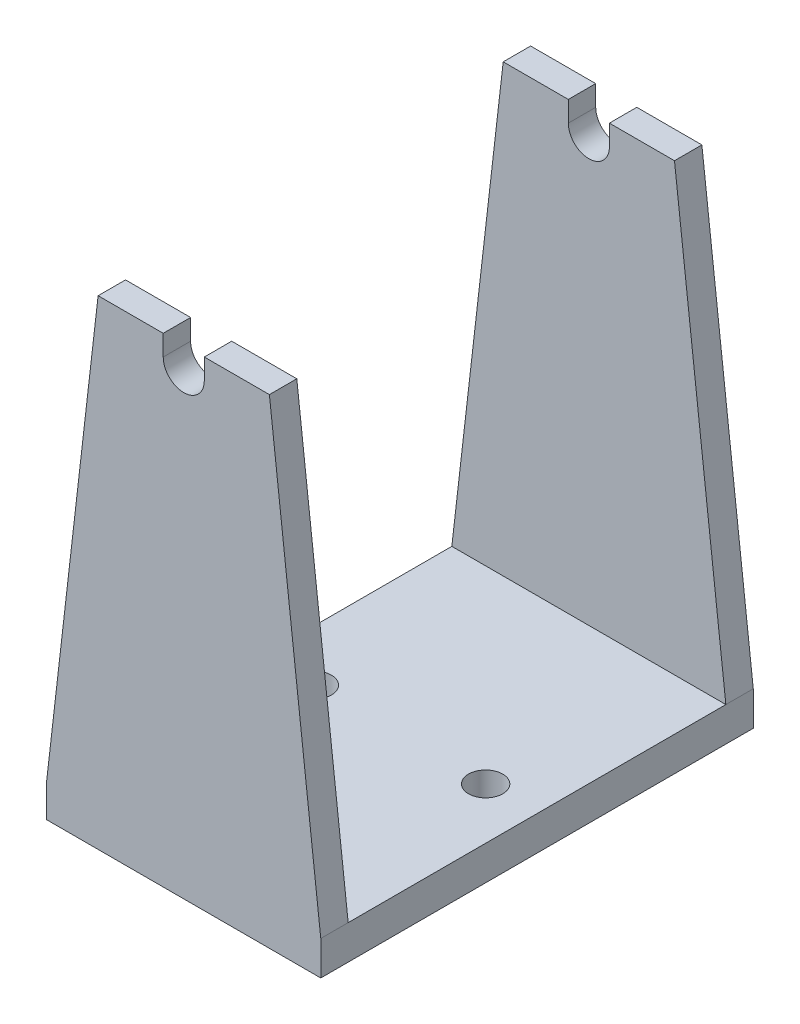
ISO-10303-21;
HEADER;
FILE_DESCRIPTION(('STEP AP214'),'2;1');
FILE_NAME('part.step','',(''),(''),'','','');
FILE_SCHEMA(('AUTOMOTIVE_DESIGN { 1 0 10303 214 1 1 1 1 }'));
ENDSEC;
DATA;
#1=APPLICATION_CONTEXT('core data for automotive mechanical design processes');
#2=APPLICATION_PROTOCOL_DEFINITION('international standard','automotive_design',2000,#1);
#3=PRODUCT_CONTEXT('',#1,'mechanical');
#4=PRODUCT('Part','Part','',(#3));
#5=PRODUCT_RELATED_PRODUCT_CATEGORY('part','',(#4));
#6=PRODUCT_DEFINITION_FORMATION('','',#4);
#7=PRODUCT_DEFINITION_CONTEXT('part definition',#1,'design');
#8=PRODUCT_DEFINITION('design','',#6,#7);
#9=PRODUCT_DEFINITION_SHAPE('','',#8);
#10=(LENGTH_UNIT() NAMED_UNIT(*) SI_UNIT(.MILLI.,.METRE.));
#11=(NAMED_UNIT(*) PLANE_ANGLE_UNIT() SI_UNIT($,.RADIAN.));
#12=(NAMED_UNIT(*) SI_UNIT($,.STERADIAN.) SOLID_ANGLE_UNIT());
#13=UNCERTAINTY_MEASURE_WITH_UNIT(LENGTH_MEASURE(1.E-05),#10,'distance_accuracy_value','');
#14=(GEOMETRIC_REPRESENTATION_CONTEXT(3) GLOBAL_UNCERTAINTY_ASSIGNED_CONTEXT((#13)) GLOBAL_UNIT_ASSIGNED_CONTEXT((#10,
#11,#12)) REPRESENTATION_CONTEXT('',''));
#15=CARTESIAN_POINT('',(0.,0.,0.));
#16=DIRECTION('',(0.,0.,1.));
#17=DIRECTION('',(1.,0.,0.));
#18=AXIS2_PLACEMENT_3D('',#15,#16,#17);
#19=CARTESIAN_POINT('',(20.,5.,4.));
#20=DIRECTION('',(-0.993408935871131,-0.114624107985131,0.));
#21=DIRECTION('',(0.114624107985131,-0.993408935871131,0.));
#22=AXIS2_PLACEMENT_3D('',#19,#20,#21);
#23=PLANE('',#22);
#24=DIRECTION('',(-0.114624107985131,0.993408935871131,0.));
#25=VECTOR('',#24,1.);
#26=CARTESIAN_POINT('',(20.,5.,0.));
#27=LINE('',#26,#25);
#28=CARTESIAN_POINT('',(20.,5.,0.));
#29=VERTEX_POINT('',#28);
#30=CARTESIAN_POINT('',(12.5,70.,0.));
#31=VERTEX_POINT('',#30);
#32=EDGE_CURVE('E144',#29,#31,#27,.T.);
#33=ORIENTED_EDGE('',*,*,#32,.T.);
#34=DIRECTION('',(0.,0.,-1.));
#35=VECTOR('',#34,1.);
#36=CARTESIAN_POINT('',(12.5,70.,4.));
#37=LINE('',#36,#35);
#38=CARTESIAN_POINT('',(12.5,70.,4.));
#39=VERTEX_POINT('',#38);
#40=EDGE_CURVE('E11',#39,#31,#37,.T.);
#41=ORIENTED_EDGE('',*,*,#40,.F.);
#42=DIRECTION('',(-0.114624107985131,0.993408935871131,0.));
#43=VECTOR('',#42,1.);
#44=CARTESIAN_POINT('',(20.,5.,4.));
#45=LINE('',#44,#43);
#46=CARTESIAN_POINT('',(20.,5.,4.));
#47=VERTEX_POINT('',#46);
#48=EDGE_CURVE('E163',#47,#39,#45,.T.);
#49=ORIENTED_EDGE('',*,*,#48,.F.);
#50=DIRECTION('',(0.,0.,-1.));
#51=VECTOR('',#50,1.);
#52=CARTESIAN_POINT('',(20.,5.,4.));
#53=LINE('',#52,#51);
#54=EDGE_CURVE('E140',#47,#29,#53,.T.);
#55=ORIENTED_EDGE('',*,*,#54,.T.);
#56=EDGE_LOOP('',(#33,#41,#49,#55));
#57=FACE_BOUND('',#56,.T.);
#58=ADVANCED_FACE('F33',(#57),#23,.F.);
#59=CARTESIAN_POINT('',(12.5,70.,4.));
#60=DIRECTION('',(0.,-1.,0.));
#61=DIRECTION('',(0.,0.,-1.));
#62=AXIS2_PLACEMENT_3D('',#59,#60,#61);
#63=PLANE('',#62);
#64=DIRECTION('',(-1.,0.,0.));
#65=VECTOR('',#64,1.);
#66=CARTESIAN_POINT('',(12.5,70.,0.));
#67=LINE('',#66,#65);
#68=CARTESIAN_POINT('',(2.99778569235798,70.,0.));
#69=VERTEX_POINT('',#68);
#70=EDGE_CURVE('E147',#31,#69,#67,.T.);
#71=ORIENTED_EDGE('',*,*,#70,.T.);
#72=DIRECTION('',(0.,0.,-1.));
#73=VECTOR('',#72,1.);
#74=CARTESIAN_POINT('',(2.99778569235798,70.,4.));
#75=LINE('',#74,#73);
#76=CARTESIAN_POINT('',(2.99778569235798,70.,4.));
#77=VERTEX_POINT('',#76);
#78=EDGE_CURVE('E41',#77,#69,#75,.T.);
#79=ORIENTED_EDGE('',*,*,#78,.F.);
#80=DIRECTION('',(-1.,0.,0.));
#81=VECTOR('',#80,1.);
#82=CARTESIAN_POINT('',(12.5,70.,4.));
#83=LINE('',#82,#81);
#84=EDGE_CURVE('E100',#39,#77,#83,.T.);
#85=ORIENTED_EDGE('',*,*,#84,.F.);
#86=ORIENTED_EDGE('',*,*,#40,.T.);
#87=EDGE_LOOP('',(#71,#79,#85,#86));
#88=FACE_BOUND('',#87,.T.);
#89=ADVANCED_FACE('F401',(#88),#63,.F.);
#90=CARTESIAN_POINT('',(2.99778569235798,70.,4.));
#91=DIRECTION('',(1.,0.,0.));
#92=DIRECTION('',(0.,1.,0.));
#93=AXIS2_PLACEMENT_3D('',#90,#91,#92);
#94=PLANE('',#93);
#95=DIRECTION('',(0.,-1.,0.));
#96=VECTOR('',#95,1.);
#97=CARTESIAN_POINT('',(2.99778569235798,70.,0.));
#98=LINE('',#97,#96);
#99=CARTESIAN_POINT('',(2.99778569235798,67.,0.));
#100=VERTEX_POINT('',#99);
#101=EDGE_CURVE('E150',#69,#100,#98,.T.);
#102=ORIENTED_EDGE('',*,*,#101,.T.);
#103=DIRECTION('',(0.,0.,-1.));
#104=VECTOR('',#103,1.);
#105=CARTESIAN_POINT('',(2.99778569235798,67.,4.));
#106=LINE('',#105,#104);
#107=CARTESIAN_POINT('',(2.99778569235798,67.,4.));
#108=VERTEX_POINT('',#107);
#109=EDGE_CURVE('E174',#108,#100,#106,.T.);
#110=ORIENTED_EDGE('',*,*,#109,.F.);
#111=DIRECTION('',(0.,-1.,0.));
#112=VECTOR('',#111,1.);
#113=CARTESIAN_POINT('',(2.99778569235798,70.,4.));
#114=LINE('',#113,#112);
#115=EDGE_CURVE('E182',#77,#108,#114,.T.);
#116=ORIENTED_EDGE('',*,*,#115,.F.);
#117=ORIENTED_EDGE('',*,*,#78,.T.);
#118=EDGE_LOOP('',(#102,#110,#116,#117));
#119=FACE_BOUND('',#118,.T.);
#120=ADVANCED_FACE('F180',(#119),#94,.F.);
#121=CARTESIAN_POINT('',(0.,67.,4.));
#122=DIRECTION('',(0.,0.,-1.));
#123=DIRECTION('',(-1.,0.,0.));
#124=AXIS2_PLACEMENT_3D('',#121,#122,#123);
#125=CYLINDRICAL_SURFACE('',#124,2.99778569235798);
#126=CARTESIAN_POINT('',(0.,67.,0.));
#127=DIRECTION('',(0.,0.,-1.));
#128=DIRECTION('',(1.,0.,0.));
#129=AXIS2_PLACEMENT_3D('',#126,#127,#128);
#130=CIRCLE('',#129,2.99778569235798);
#131=CARTESIAN_POINT('',(-2.99778569235798,67.,0.));
#132=VERTEX_POINT('',#131);
#133=EDGE_CURVE('E152',#100,#132,#130,.T.);
#134=ORIENTED_EDGE('',*,*,#133,.T.);
#135=DIRECTION('',(0.,0.,-1.));
#136=VECTOR('',#135,1.);
#137=CARTESIAN_POINT('',(-2.99778569235798,67.,4.));
#138=LINE('',#137,#136);
#139=CARTESIAN_POINT('',(-2.99778569235798,67.,4.));
#140=VERTEX_POINT('',#139);
#141=EDGE_CURVE('E132',#140,#132,#138,.T.);
#142=ORIENTED_EDGE('',*,*,#141,.F.);
#143=CARTESIAN_POINT('',(0.,67.,4.));
#144=DIRECTION('',(0.,0.,-1.));
#145=DIRECTION('',(1.,0.,0.));
#146=AXIS2_PLACEMENT_3D('',#143,#144,#145);
#147=CIRCLE('',#146,2.99778569235798);
#148=EDGE_CURVE('E120',#108,#140,#147,.T.);
#149=ORIENTED_EDGE('',*,*,#148,.F.);
#150=ORIENTED_EDGE('',*,*,#109,.T.);
#151=EDGE_LOOP('',(#134,#142,#149,#150));
#152=FACE_BOUND('',#151,.T.);
#153=ADVANCED_FACE('F188',(#152),#125,.F.);
#154=CARTESIAN_POINT('',(-2.99778569235798,70.,4.));
#155=DIRECTION('',(-1.,0.,0.));
#156=DIRECTION('',(0.,-1.,0.));
#157=AXIS2_PLACEMENT_3D('',#154,#155,#156);
#158=PLANE('',#157);
#159=DIRECTION('',(0.,1.,0.));
#160=VECTOR('',#159,1.);
#161=CARTESIAN_POINT('',(-2.99778569235798,70.,0.));
#162=LINE('',#161,#160);
#163=CARTESIAN_POINT('',(-2.99778569235798,70.,0.));
#164=VERTEX_POINT('',#163);
#165=EDGE_CURVE('E129',#132,#164,#162,.T.);
#166=ORIENTED_EDGE('',*,*,#165,.T.);
#167=DIRECTION('',(0.,0.,-1.));
#168=VECTOR('',#167,1.);
#169=CARTESIAN_POINT('',(-2.99778569235798,70.,4.));
#170=LINE('',#169,#168);
#171=CARTESIAN_POINT('',(-2.99778569235798,70.,4.));
#172=VERTEX_POINT('',#171);
#173=EDGE_CURVE('E126',#172,#164,#170,.T.);
#174=ORIENTED_EDGE('',*,*,#173,.F.);
#175=DIRECTION('',(0.,1.,0.));
#176=VECTOR('',#175,1.);
#177=CARTESIAN_POINT('',(-2.99778569235798,70.,4.));
#178=LINE('',#177,#176);
#179=EDGE_CURVE('E113',#140,#172,#178,.T.);
#180=ORIENTED_EDGE('',*,*,#179,.F.);
#181=ORIENTED_EDGE('',*,*,#141,.T.);
#182=EDGE_LOOP('',(#166,#174,#180,#181));
#183=FACE_BOUND('',#182,.T.);
#184=ADVANCED_FACE('F127',(#183),#158,.F.);
#185=CARTESIAN_POINT('',(-12.5,70.,4.));
#186=DIRECTION('',(0.,-1.,0.));
#187=DIRECTION('',(0.,0.,-1.));
#188=AXIS2_PLACEMENT_3D('',#185,#186,#187);
#189=PLANE('',#188);
#190=DIRECTION('',(-1.,0.,0.));
#191=VECTOR('',#190,1.);
#192=CARTESIAN_POINT('',(-12.5,70.,0.));
#193=LINE('',#192,#191);
#194=CARTESIAN_POINT('',(-12.5,70.,0.));
#195=VERTEX_POINT('',#194);
#196=EDGE_CURVE('E155',#164,#195,#193,.T.);
#197=ORIENTED_EDGE('',*,*,#196,.T.);
#198=DIRECTION('',(0.,0.,-1.));
#199=VECTOR('',#198,1.);
#200=CARTESIAN_POINT('',(-12.5,70.,4.));
#201=LINE('',#200,#199);
#202=CARTESIAN_POINT('',(-12.5,70.,4.));
#203=VERTEX_POINT('',#202);
#204=EDGE_CURVE('E133',#203,#195,#201,.T.);
#205=ORIENTED_EDGE('',*,*,#204,.F.);
#206=DIRECTION('',(-1.,0.,0.));
#207=VECTOR('',#206,1.);
#208=CARTESIAN_POINT('',(-12.5,70.,4.));
#209=LINE('',#208,#207);
#210=EDGE_CURVE('E117',#172,#203,#209,.T.);
#211=ORIENTED_EDGE('',*,*,#210,.F.);
#212=ORIENTED_EDGE('',*,*,#173,.T.);
#213=EDGE_LOOP('',(#197,#205,#211,#212));
#214=FACE_BOUND('',#213,.T.);
#215=ADVANCED_FACE('F135',(#214),#189,.F.);
#216=CARTESIAN_POINT('',(-20.,5.,4.));
#217=DIRECTION('',(0.993408935871131,-0.114624107985131,0.));
#218=DIRECTION('',(0.114624107985131,0.993408935871131,0.));
#219=AXIS2_PLACEMENT_3D('',#216,#217,#218);
#220=PLANE('',#219);
#221=DIRECTION('',(-0.114624107985131,-0.993408935871131,0.));
#222=VECTOR('',#221,1.);
#223=CARTESIAN_POINT('',(-20.,5.,0.));
#224=LINE('',#223,#222);
#225=CARTESIAN_POINT('',(-20.,5.,0.));
#226=VERTEX_POINT('',#225);
#227=EDGE_CURVE('E157',#195,#226,#224,.T.);
#228=ORIENTED_EDGE('',*,*,#227,.T.);
#229=DIRECTION('',(0.,0.,-1.));
#230=VECTOR('',#229,1.);
#231=CARTESIAN_POINT('',(-20.,5.,4.));
#232=LINE('',#231,#230);
#233=CARTESIAN_POINT('',(-20.,5.,4.));
#234=VERTEX_POINT('',#233);
#235=EDGE_CURVE('E169',#234,#226,#232,.T.);
#236=ORIENTED_EDGE('',*,*,#235,.F.);
#237=DIRECTION('',(-0.114624107985131,-0.993408935871131,0.));
#238=VECTOR('',#237,1.);
#239=CARTESIAN_POINT('',(-20.,5.,4.));
#240=LINE('',#239,#238);
#241=EDGE_CURVE('E138',#203,#234,#240,.T.);
#242=ORIENTED_EDGE('',*,*,#241,.F.);
#243=ORIENTED_EDGE('',*,*,#204,.T.);
#244=EDGE_LOOP('',(#228,#236,#242,#243));
#245=FACE_BOUND('',#244,.T.);
#246=ADVANCED_FACE('F417',(#245),#220,.F.);
#247=CARTESIAN_POINT('',(-20.,0.,4.));
#248=DIRECTION('',(1.,0.,0.));
#249=DIRECTION('',(0.,0.,-1.));
#250=AXIS2_PLACEMENT_3D('',#247,#248,#249);
#251=PLANE('',#250);
#252=DIRECTION('',(0.,-1.,0.));
#253=VECTOR('',#252,1.);
#254=CARTESIAN_POINT('',(-20.,0.,0.));
#255=LINE('',#254,#253);
#256=CARTESIAN_POINT('',(-20.,0.,0.));
#257=VERTEX_POINT('',#256);
#258=EDGE_CURVE('E159',#226,#257,#255,.T.);
#259=ORIENTED_EDGE('',*,*,#258,.T.);
#260=DIRECTION('',(0.,0.,-1.));
#261=VECTOR('',#260,1.);
#262=CARTESIAN_POINT('',(-20.,0.,4.));
#263=LINE('',#262,#261);
#264=CARTESIAN_POINT('',(-20.,0.,63.13));
#265=VERTEX_POINT('',#264);
#266=EDGE_CURVE('E167',#265,#257,#263,.T.);
#267=ORIENTED_EDGE('',*,*,#266,.F.);
#268=DIRECTION('',(0.,-1.,0.));
#269=VECTOR('',#268,1.);
#270=CARTESIAN_POINT('',(-20.,5.,63.13));
#271=LINE('',#270,#269);
#272=CARTESIAN_POINT('',(-20.,5.,63.13));
#273=VERTEX_POINT('',#272);
#274=EDGE_CURVE('E258',#273,#265,#271,.T.);
#275=ORIENTED_EDGE('',*,*,#274,.F.);
#276=DIRECTION('',(0.,0.,-1.));
#277=VECTOR('',#276,1.);
#278=CARTESIAN_POINT('',(-20.,5.,63.13));
#279=LINE('',#278,#277);
#280=CARTESIAN_POINT('',(-20.,5.,59.13));
#281=VERTEX_POINT('',#280);
#282=EDGE_CURVE('E217',#273,#281,#279,.T.);
#283=ORIENTED_EDGE('',*,*,#282,.T.);
#284=DIRECTION('',(0.,0.,-1.));
#285=VECTOR('',#284,1.);
#286=CARTESIAN_POINT('',(-20.,5.,59.13));
#287=LINE('',#286,#285);
#288=EDGE_CURVE('E195',#281,#234,#287,.T.);
#289=ORIENTED_EDGE('',*,*,#288,.T.);
#290=ORIENTED_EDGE('',*,*,#235,.T.);
#291=EDGE_LOOP('',(#259,#267,#275,#283,#289,#290));
#292=FACE_BOUND('',#291,.T.);
#293=ADVANCED_FACE('F314',(#292),#251,.F.);
#294=CARTESIAN_POINT('',(-20.,0.,4.));
#295=DIRECTION('',(0.,1.,0.));
#296=DIRECTION('',(0.,0.,1.));
#297=AXIS2_PLACEMENT_3D('',#294,#295,#296);
#298=PLANE('',#297);
#299=CARTESIAN_POINT('',(-12.5,0.,31.565));
#300=DIRECTION('',(0.,1.,0.));
#301=DIRECTION('',(0.,0.,1.));
#302=AXIS2_PLACEMENT_3D('',#299,#300,#301);
#303=CIRCLE('',#302,2.5);
#304=CARTESIAN_POINT('',(-12.5,0.,34.065));
#305=VERTEX_POINT('',#304);
#306=EDGE_CURVE('E281',#305,#305,#303,.T.);
#307=ORIENTED_EDGE('',*,*,#306,.T.);
#308=EDGE_LOOP('',(#307));
#309=FACE_BOUND('',#308,.T.);
#310=CARTESIAN_POINT('',(12.5,0.,31.565));
#311=DIRECTION('',(0.,1.,0.));
#312=DIRECTION('',(0.,0.,1.));
#313=AXIS2_PLACEMENT_3D('',#310,#311,#312);
#314=CIRCLE('',#313,2.5);
#315=CARTESIAN_POINT('',(12.5,0.,34.065));
#316=VERTEX_POINT('',#315);
#317=EDGE_CURVE('E249',#316,#316,#314,.T.);
#318=ORIENTED_EDGE('',*,*,#317,.T.);
#319=EDGE_LOOP('',(#318));
#320=FACE_BOUND('',#319,.T.);
#321=DIRECTION('',(1.,0.,0.));
#322=VECTOR('',#321,1.);
#323=CARTESIAN_POINT('',(-20.,0.,0.));
#324=LINE('',#323,#322);
#325=CARTESIAN_POINT('',(20.,0.,0.));
#326=VERTEX_POINT('',#325);
#327=EDGE_CURVE('E86',#257,#326,#324,.T.);
#328=ORIENTED_EDGE('',*,*,#327,.T.);
#329=DIRECTION('',(0.,0.,-1.));
#330=VECTOR('',#329,1.);
#331=CARTESIAN_POINT('',(20.,0.,4.));
#332=LINE('',#331,#330);
#333=CARTESIAN_POINT('',(20.,0.,63.13));
#334=VERTEX_POINT('',#333);
#335=EDGE_CURVE('E165',#334,#326,#332,.T.);
#336=ORIENTED_EDGE('',*,*,#335,.F.);
#337=DIRECTION('',(1.,0.,0.));
#338=VECTOR('',#337,1.);
#339=CARTESIAN_POINT('',(-20.,0.,63.13));
#340=LINE('',#339,#338);
#341=EDGE_CURVE('E255',#265,#334,#340,.T.);
#342=ORIENTED_EDGE('',*,*,#341,.F.);
#343=ORIENTED_EDGE('',*,*,#266,.T.);
#344=EDGE_LOOP('',(#328,#336,#342,#343));
#345=FACE_BOUND('',#344,.T.);
#346=ADVANCED_FACE('F290',(#309,#320,#345),#298,.F.);
#347=CARTESIAN_POINT('',(20.,0.,4.));
#348=DIRECTION('',(-1.,0.,0.));
#349=DIRECTION('',(0.,0.,1.));
#350=AXIS2_PLACEMENT_3D('',#347,#348,#349);
#351=PLANE('',#350);
#352=DIRECTION('',(0.,1.,0.));
#353=VECTOR('',#352,1.);
#354=CARTESIAN_POINT('',(20.,0.,0.));
#355=LINE('',#354,#353);
#356=EDGE_CURVE('E92',#326,#29,#355,.T.);
#357=ORIENTED_EDGE('',*,*,#356,.T.);
#358=ORIENTED_EDGE('',*,*,#54,.F.);
#359=DIRECTION('',(0.,0.,-1.));
#360=VECTOR('',#359,1.);
#361=CARTESIAN_POINT('',(20.,5.,59.13));
#362=LINE('',#361,#360);
#363=CARTESIAN_POINT('',(20.,5.,59.13));
#364=VERTEX_POINT('',#363);
#365=EDGE_CURVE('E148',#364,#47,#362,.T.);
#366=ORIENTED_EDGE('',*,*,#365,.F.);
#367=DIRECTION('',(0.,0.,-1.));
#368=VECTOR('',#367,1.);
#369=CARTESIAN_POINT('',(20.,5.,63.13));
#370=LINE('',#369,#368);
#371=CARTESIAN_POINT('',(20.,5.,63.13));
#372=VERTEX_POINT('',#371);
#373=EDGE_CURVE('E220',#372,#364,#370,.T.);
#374=ORIENTED_EDGE('',*,*,#373,.F.);
#375=DIRECTION('',(0.,1.,0.));
#376=VECTOR('',#375,1.);
#377=CARTESIAN_POINT('',(20.,0.,63.13));
#378=LINE('',#377,#376);
#379=EDGE_CURVE('E252',#334,#372,#378,.T.);
#380=ORIENTED_EDGE('',*,*,#379,.F.);
#381=ORIENTED_EDGE('',*,*,#335,.T.);
#382=EDGE_LOOP('',(#357,#358,#366,#374,#380,#381));
#383=FACE_BOUND('',#382,.T.);
#384=ADVANCED_FACE('F353',(#383),#351,.F.);
#385=CARTESIAN_POINT('',(0.,67.,4.));
#386=DIRECTION('',(0.,0.,1.));
#387=DIRECTION('',(1.,0.,0.));
#388=AXIS2_PLACEMENT_3D('',#385,#386,#387);
#389=PLANE('',#388);
#390=DIRECTION('',(-1.,0.,0.));
#391=VECTOR('',#390,1.);
#392=CARTESIAN_POINT('',(-20.,5.,4.));
#393=LINE('',#392,#391);
#394=EDGE_CURVE('E49',#47,#234,#393,.T.);
#395=ORIENTED_EDGE('',*,*,#394,.F.);
#396=ORIENTED_EDGE('',*,*,#48,.T.);
#397=ORIENTED_EDGE('',*,*,#84,.T.);
#398=ORIENTED_EDGE('',*,*,#115,.T.);
#399=ORIENTED_EDGE('',*,*,#148,.T.);
#400=ORIENTED_EDGE('',*,*,#179,.T.);
#401=ORIENTED_EDGE('',*,*,#210,.T.);
#402=ORIENTED_EDGE('',*,*,#241,.T.);
#403=EDGE_LOOP('',(#395,#396,#397,#398,#399,#400,#401,#402));
#404=FACE_BOUND('',#403,.T.);
#405=ADVANCED_FACE('F115',(#404),#389,.T.);
#406=CARTESIAN_POINT('',(0.,67.,0.));
#407=DIRECTION('',(0.,0.,1.));
#408=DIRECTION('',(1.,0.,0.));
#409=AXIS2_PLACEMENT_3D('',#406,#407,#408);
#410=PLANE('',#409);
#411=ORIENTED_EDGE('',*,*,#32,.F.);
#412=ORIENTED_EDGE('',*,*,#356,.F.);
#413=ORIENTED_EDGE('',*,*,#327,.F.);
#414=ORIENTED_EDGE('',*,*,#258,.F.);
#415=ORIENTED_EDGE('',*,*,#227,.F.);
#416=ORIENTED_EDGE('',*,*,#196,.F.);
#417=ORIENTED_EDGE('',*,*,#165,.F.);
#418=ORIENTED_EDGE('',*,*,#133,.F.);
#419=ORIENTED_EDGE('',*,*,#101,.F.);
#420=ORIENTED_EDGE('',*,*,#70,.F.);
#421=EDGE_LOOP('',(#411,#412,#413,#414,#415,#416,#417,#418,#419,#420));
#422=FACE_BOUND('',#421,.T.);
#423=ADVANCED_FACE('F186',(#422),#410,.F.);
#424=CARTESIAN_POINT('',(-20.,5.,59.13));
#425=DIRECTION('',(0.,-1.,0.));
#426=DIRECTION('',(0.,0.,-1.));
#427=AXIS2_PLACEMENT_3D('',#424,#425,#426);
#428=PLANE('',#427);
#429=CARTESIAN_POINT('',(-12.5,5.,31.565));
#430=DIRECTION('',(0.,1.,0.));
#431=DIRECTION('',(0.,0.,1.));
#432=AXIS2_PLACEMENT_3D('',#429,#430,#431);
#433=CIRCLE('',#432,2.5);
#434=CARTESIAN_POINT('',(-12.5,5.,34.065));
#435=VERTEX_POINT('',#434);
#436=EDGE_CURVE('E284',#435,#435,#433,.T.);
#437=ORIENTED_EDGE('',*,*,#436,.F.);
#438=EDGE_LOOP('',(#437));
#439=FACE_BOUND('',#438,.T.);
#440=CARTESIAN_POINT('',(12.5,5.,31.565));
#441=DIRECTION('',(0.,1.,0.));
#442=DIRECTION('',(0.,0.,1.));
#443=AXIS2_PLACEMENT_3D('',#440,#441,#442);
#444=CIRCLE('',#443,2.5);
#445=CARTESIAN_POINT('',(12.5,5.,34.065));
#446=VERTEX_POINT('',#445);
#447=EDGE_CURVE('E278',#446,#446,#444,.T.);
#448=ORIENTED_EDGE('',*,*,#447,.F.);
#449=EDGE_LOOP('',(#448));
#450=FACE_BOUND('',#449,.T.);
#451=ORIENTED_EDGE('',*,*,#394,.T.);
#452=ORIENTED_EDGE('',*,*,#288,.F.);
#453=DIRECTION('',(-1.,0.,0.));
#454=VECTOR('',#453,1.);
#455=CARTESIAN_POINT('',(-20.,5.,59.13));
#456=LINE('',#455,#454);
#457=EDGE_CURVE('E198',#364,#281,#456,.T.);
#458=ORIENTED_EDGE('',*,*,#457,.F.);
#459=ORIENTED_EDGE('',*,*,#365,.T.);
#460=EDGE_LOOP('',(#451,#452,#458,#459));
#461=FACE_BOUND('',#460,.T.);
#462=ADVANCED_FACE('F300',(#439,#450,#461),#428,.F.);
#463=CARTESIAN_POINT('',(0.,67.,59.13));
#464=DIRECTION('',(0.,0.,1.));
#465=DIRECTION('',(1.,0.,0.));
#466=AXIS2_PLACEMENT_3D('',#463,#464,#465);
#467=PLANE('',#466);
#468=DIRECTION('',(-0.114624107985131,0.993408935871131,0.));
#469=VECTOR('',#468,1.);
#470=CARTESIAN_POINT('',(20.,5.,59.13));
#471=LINE('',#470,#469);
#472=CARTESIAN_POINT('',(12.5,70.,59.13));
#473=VERTEX_POINT('',#472);
#474=EDGE_CURVE('E227',#364,#473,#471,.T.);
#475=ORIENTED_EDGE('',*,*,#474,.F.);
#476=ORIENTED_EDGE('',*,*,#457,.T.);
#477=DIRECTION('',(-0.114624107985131,-0.993408935871131,0.));
#478=VECTOR('',#477,1.);
#479=CARTESIAN_POINT('',(-12.5,70.,59.13));
#480=LINE('',#479,#478);
#481=CARTESIAN_POINT('',(-12.5,70.,59.13));
#482=VERTEX_POINT('',#481);
#483=EDGE_CURVE('E231',#482,#281,#480,.T.);
#484=ORIENTED_EDGE('',*,*,#483,.F.);
#485=DIRECTION('',(-1.,0.,0.));
#486=VECTOR('',#485,1.);
#487=CARTESIAN_POINT('',(-2.99778569235798,70.,59.13));
#488=LINE('',#487,#486);
#489=CARTESIAN_POINT('',(-2.99778569235798,70.,59.13));
#490=VERTEX_POINT('',#489);
#491=EDGE_CURVE('E234',#490,#482,#488,.T.);
#492=ORIENTED_EDGE('',*,*,#491,.F.);
#493=DIRECTION('',(0.,1.,0.));
#494=VECTOR('',#493,1.);
#495=CARTESIAN_POINT('',(-2.99778569235798,67.,59.13));
#496=LINE('',#495,#494);
#497=CARTESIAN_POINT('',(-2.99778569235798,67.,59.13));
#498=VERTEX_POINT('',#497);
#499=EDGE_CURVE('E237',#498,#490,#496,.T.);
#500=ORIENTED_EDGE('',*,*,#499,.F.);
#501=CARTESIAN_POINT('',(0.,67.,59.13));
#502=DIRECTION('',(0.,0.,-1.));
#503=DIRECTION('',(1.,0.,0.));
#504=AXIS2_PLACEMENT_3D('',#501,#502,#503);
#505=CIRCLE('',#504,2.99778569235798);
#506=CARTESIAN_POINT('',(2.99778569235798,67.,59.13));
#507=VERTEX_POINT('',#506);
#508=EDGE_CURVE('E240',#507,#498,#505,.T.);
#509=ORIENTED_EDGE('',*,*,#508,.F.);
#510=DIRECTION('',(0.,-1.,0.));
#511=VECTOR('',#510,1.);
#512=CARTESIAN_POINT('',(2.99778569235798,70.,59.13));
#513=LINE('',#512,#511);
#514=CARTESIAN_POINT('',(2.99778569235798,70.,59.13));
#515=VERTEX_POINT('',#514);
#516=EDGE_CURVE('E243',#515,#507,#513,.T.);
#517=ORIENTED_EDGE('',*,*,#516,.F.);
#518=DIRECTION('',(-1.,0.,0.));
#519=VECTOR('',#518,1.);
#520=CARTESIAN_POINT('',(12.5,70.,59.13));
#521=LINE('',#520,#519);
#522=EDGE_CURVE('E246',#473,#515,#521,.T.);
#523=ORIENTED_EDGE('',*,*,#522,.F.);
#524=EDGE_LOOP('',(#475,#476,#484,#492,#500,#509,#517,#523));
#525=FACE_BOUND('',#524,.T.);
#526=ADVANCED_FACE('F303',(#525),#467,.F.);
#527=CARTESIAN_POINT('',(12.5,70.,63.13));
#528=DIRECTION('',(0.,-1.,0.));
#529=DIRECTION('',(0.,0.,-1.));
#530=AXIS2_PLACEMENT_3D('',#527,#528,#529);
#531=PLANE('',#530);
#532=ORIENTED_EDGE('',*,*,#522,.T.);
#533=DIRECTION('',(0.,0.,-1.));
#534=VECTOR('',#533,1.);
#535=CARTESIAN_POINT('',(2.99778569235798,70.,63.13));
#536=LINE('',#535,#534);
#537=CARTESIAN_POINT('',(2.99778569235798,70.,63.13));
#538=VERTEX_POINT('',#537);
#539=EDGE_CURVE('E200',#538,#515,#536,.T.);
#540=ORIENTED_EDGE('',*,*,#539,.F.);
#541=DIRECTION('',(-1.,0.,0.));
#542=VECTOR('',#541,1.);
#543=CARTESIAN_POINT('',(12.5,70.,63.13));
#544=LINE('',#543,#542);
#545=CARTESIAN_POINT('',(12.5,70.,63.13));
#546=VERTEX_POINT('',#545);
#547=EDGE_CURVE('E230',#546,#538,#544,.T.);
#548=ORIENTED_EDGE('',*,*,#547,.F.);
#549=DIRECTION('',(0.,0.,-1.));
#550=VECTOR('',#549,1.);
#551=CARTESIAN_POINT('',(12.5,70.,63.13));
#552=LINE('',#551,#550);
#553=EDGE_CURVE('E223',#546,#473,#552,.T.);
#554=ORIENTED_EDGE('',*,*,#553,.T.);
#555=EDGE_LOOP('',(#532,#540,#548,#554));
#556=FACE_BOUND('',#555,.T.);
#557=ADVANCED_FACE('F366',(#556),#531,.F.);
#558=CARTESIAN_POINT('',(2.99778569235798,70.,63.13));
#559=DIRECTION('',(1.,0.,0.));
#560=DIRECTION('',(0.,1.,0.));
#561=AXIS2_PLACEMENT_3D('',#558,#559,#560);
#562=PLANE('',#561);
#563=ORIENTED_EDGE('',*,*,#516,.T.);
#564=DIRECTION('',(0.,0.,-1.));
#565=VECTOR('',#564,1.);
#566=CARTESIAN_POINT('',(2.99778569235798,67.,63.13));
#567=LINE('',#566,#565);
#568=CARTESIAN_POINT('',(2.99778569235798,67.,63.13));
#569=VERTEX_POINT('',#568);
#570=EDGE_CURVE('E205',#569,#507,#567,.T.);
#571=ORIENTED_EDGE('',*,*,#570,.F.);
#572=DIRECTION('',(0.,-1.,0.));
#573=VECTOR('',#572,1.);
#574=CARTESIAN_POINT('',(2.99778569235798,70.,63.13));
#575=LINE('',#574,#573);
#576=EDGE_CURVE('E273',#538,#569,#575,.T.);
#577=ORIENTED_EDGE('',*,*,#576,.F.);
#578=ORIENTED_EDGE('',*,*,#539,.T.);
#579=EDGE_LOOP('',(#563,#571,#577,#578));
#580=FACE_BOUND('',#579,.T.);
#581=ADVANCED_FACE('F391',(#580),#562,.F.);
#582=CARTESIAN_POINT('',(0.,67.,63.13));
#583=DIRECTION('',(0.,0.,-1.));
#584=DIRECTION('',(-1.,0.,0.));
#585=AXIS2_PLACEMENT_3D('',#582,#583,#584);
#586=CYLINDRICAL_SURFACE('',#585,2.99778569235798);
#587=ORIENTED_EDGE('',*,*,#508,.T.);
#588=DIRECTION('',(0.,0.,-1.));
#589=VECTOR('',#588,1.);
#590=CARTESIAN_POINT('',(-2.99778569235798,67.,63.13));
#591=LINE('',#590,#589);
#592=CARTESIAN_POINT('',(-2.99778569235798,67.,63.13));
#593=VERTEX_POINT('',#592);
#594=EDGE_CURVE('E208',#593,#498,#591,.T.);
#595=ORIENTED_EDGE('',*,*,#594,.F.);
#596=CARTESIAN_POINT('',(0.,67.,63.13));
#597=DIRECTION('',(0.,0.,-1.));
#598=DIRECTION('',(1.,0.,0.));
#599=AXIS2_PLACEMENT_3D('',#596,#597,#598);
#600=CIRCLE('',#599,2.99778569235798);
#601=EDGE_CURVE('E270',#569,#593,#600,.T.);
#602=ORIENTED_EDGE('',*,*,#601,.F.);
#603=ORIENTED_EDGE('',*,*,#570,.T.);
#604=EDGE_LOOP('',(#587,#595,#602,#603));
#605=FACE_BOUND('',#604,.T.);
#606=ADVANCED_FACE('F390',(#605),#586,.F.);
#607=CARTESIAN_POINT('',(-2.99778569235798,67.,63.13));
#608=DIRECTION('',(-1.,0.,0.));
#609=DIRECTION('',(0.,-1.,0.));
#610=AXIS2_PLACEMENT_3D('',#607,#608,#609);
#611=PLANE('',#610);
#612=ORIENTED_EDGE('',*,*,#499,.T.);
#613=DIRECTION('',(0.,0.,-1.));
#614=VECTOR('',#613,1.);
#615=CARTESIAN_POINT('',(-2.99778569235798,70.,63.13));
#616=LINE('',#615,#614);
#617=CARTESIAN_POINT('',(-2.99778569235798,70.,63.13));
#618=VERTEX_POINT('',#617);
#619=EDGE_CURVE('E211',#618,#490,#616,.T.);
#620=ORIENTED_EDGE('',*,*,#619,.F.);
#621=DIRECTION('',(0.,1.,0.));
#622=VECTOR('',#621,1.);
#623=CARTESIAN_POINT('',(-2.99778569235798,67.,63.13));
#624=LINE('',#623,#622);
#625=EDGE_CURVE('E267',#593,#618,#624,.T.);
#626=ORIENTED_EDGE('',*,*,#625,.F.);
#627=ORIENTED_EDGE('',*,*,#594,.T.);
#628=EDGE_LOOP('',(#612,#620,#626,#627));
#629=FACE_BOUND('',#628,.T.);
#630=ADVANCED_FACE('F384',(#629),#611,.F.);
#631=CARTESIAN_POINT('',(-2.99778569235798,70.,63.13));
#632=DIRECTION('',(0.,-1.,0.));
#633=DIRECTION('',(0.,0.,-1.));
#634=AXIS2_PLACEMENT_3D('',#631,#632,#633);
#635=PLANE('',#634);
#636=ORIENTED_EDGE('',*,*,#491,.T.);
#637=DIRECTION('',(0.,0.,-1.));
#638=VECTOR('',#637,1.);
#639=CARTESIAN_POINT('',(-12.5,70.,63.13));
#640=LINE('',#639,#638);
#641=CARTESIAN_POINT('',(-12.5,70.,63.13));
#642=VERTEX_POINT('',#641);
#643=EDGE_CURVE('E214',#642,#482,#640,.T.);
#644=ORIENTED_EDGE('',*,*,#643,.F.);
#645=DIRECTION('',(-1.,0.,0.));
#646=VECTOR('',#645,1.);
#647=CARTESIAN_POINT('',(-2.99778569235798,70.,63.13));
#648=LINE('',#647,#646);
#649=EDGE_CURVE('E264',#618,#642,#648,.T.);
#650=ORIENTED_EDGE('',*,*,#649,.F.);
#651=ORIENTED_EDGE('',*,*,#619,.T.);
#652=EDGE_LOOP('',(#636,#644,#650,#651));
#653=FACE_BOUND('',#652,.T.);
#654=ADVANCED_FACE('F388',(#653),#635,.F.);
#655=CARTESIAN_POINT('',(-12.5,70.,63.13));
#656=DIRECTION('',(0.993408935871131,-0.114624107985131,0.));
#657=DIRECTION('',(0.114624107985131,0.993408935871131,0.));
#658=AXIS2_PLACEMENT_3D('',#655,#656,#657);
#659=PLANE('',#658);
#660=ORIENTED_EDGE('',*,*,#483,.T.);
#661=ORIENTED_EDGE('',*,*,#282,.F.);
#662=DIRECTION('',(-0.114624107985131,-0.993408935871131,0.));
#663=VECTOR('',#662,1.);
#664=CARTESIAN_POINT('',(-12.5,70.,63.13));
#665=LINE('',#664,#663);
#666=EDGE_CURVE('E261',#642,#273,#665,.T.);
#667=ORIENTED_EDGE('',*,*,#666,.F.);
#668=ORIENTED_EDGE('',*,*,#643,.T.);
#669=EDGE_LOOP('',(#660,#661,#667,#668));
#670=FACE_BOUND('',#669,.T.);
#671=ADVANCED_FACE('F325',(#670),#659,.F.);
#672=CARTESIAN_POINT('',(20.,5.,63.13));
#673=DIRECTION('',(-0.993408935871131,-0.114624107985131,0.));
#674=DIRECTION('',(0.114624107985131,-0.993408935871131,0.));
#675=AXIS2_PLACEMENT_3D('',#672,#673,#674);
#676=PLANE('',#675);
#677=ORIENTED_EDGE('',*,*,#474,.T.);
#678=ORIENTED_EDGE('',*,*,#553,.F.);
#679=DIRECTION('',(-0.114624107985131,0.993408935871131,0.));
#680=VECTOR('',#679,1.);
#681=CARTESIAN_POINT('',(20.,5.,63.13));
#682=LINE('',#681,#680);
#683=EDGE_CURVE('E226',#372,#546,#682,.T.);
#684=ORIENTED_EDGE('',*,*,#683,.F.);
#685=ORIENTED_EDGE('',*,*,#373,.T.);
#686=EDGE_LOOP('',(#677,#678,#684,#685));
#687=FACE_BOUND('',#686,.T.);
#688=ADVANCED_FACE('F360',(#687),#676,.F.);
#689=CARTESIAN_POINT('',(0.,67.,63.13));
#690=DIRECTION('',(0.,0.,1.));
#691=DIRECTION('',(1.,0.,0.));
#692=AXIS2_PLACEMENT_3D('',#689,#690,#691);
#693=PLANE('',#692);
#694=ORIENTED_EDGE('',*,*,#547,.T.);
#695=ORIENTED_EDGE('',*,*,#576,.T.);
#696=ORIENTED_EDGE('',*,*,#601,.T.);
#697=ORIENTED_EDGE('',*,*,#625,.T.);
#698=ORIENTED_EDGE('',*,*,#649,.T.);
#699=ORIENTED_EDGE('',*,*,#666,.T.);
#700=ORIENTED_EDGE('',*,*,#274,.T.);
#701=ORIENTED_EDGE('',*,*,#341,.T.);
#702=ORIENTED_EDGE('',*,*,#379,.T.);
#703=ORIENTED_EDGE('',*,*,#683,.T.);
#704=EDGE_LOOP('',(#694,#695,#696,#697,#698,#699,#700,#701,#702,#703));
#705=FACE_BOUND('',#704,.T.);
#706=ADVANCED_FACE('F368',(#705),#693,.T.);
#707=CARTESIAN_POINT('',(12.5,0.,31.565));
#708=DIRECTION('',(0.,1.,0.));
#709=DIRECTION('',(0.,0.,1.));
#710=AXIS2_PLACEMENT_3D('',#707,#708,#709);
#711=CYLINDRICAL_SURFACE('',#710,2.5);
#712=ORIENTED_EDGE('',*,*,#317,.F.);
#713=EDGE_LOOP('',(#712));
#714=FACE_BOUND('',#713,.T.);
#715=ORIENTED_EDGE('',*,*,#447,.T.);
#716=EDGE_LOOP('',(#715));
#717=FACE_BOUND('',#716,.T.);
#718=ADVANCED_FACE('F296',(#714,#717),#711,.F.);
#719=CARTESIAN_POINT('',(-12.5,0.,31.565));
#720=DIRECTION('',(0.,1.,0.));
#721=DIRECTION('',(0.,0.,1.));
#722=AXIS2_PLACEMENT_3D('',#719,#720,#721);
#723=CYLINDRICAL_SURFACE('',#722,2.5);
#724=ORIENTED_EDGE('',*,*,#306,.F.);
#725=EDGE_LOOP('',(#724));
#726=FACE_BOUND('',#725,.T.);
#727=ORIENTED_EDGE('',*,*,#436,.T.);
#728=EDGE_LOOP('',(#727));
#729=FACE_BOUND('',#728,.T.);
#730=ADVANCED_FACE('F293',(#726,#729),#723,.F.);
#731=CLOSED_SHELL('',(#58,#89,#120,#153,#184,#215,#246,#293,#346,#384,#405,#423,#462,#526,#557,
#581,#606,#630,#654,#671,#688,#706,#718,#730));
#732=MANIFOLD_SOLID_BREP('B2',#731);
#733=ADVANCED_BREP_SHAPE_REPRESENTATION('',(#18,#732),#14);
#734=SHAPE_DEFINITION_REPRESENTATION(#9,#733);
ENDSEC;
END-ISO-10303-21;
